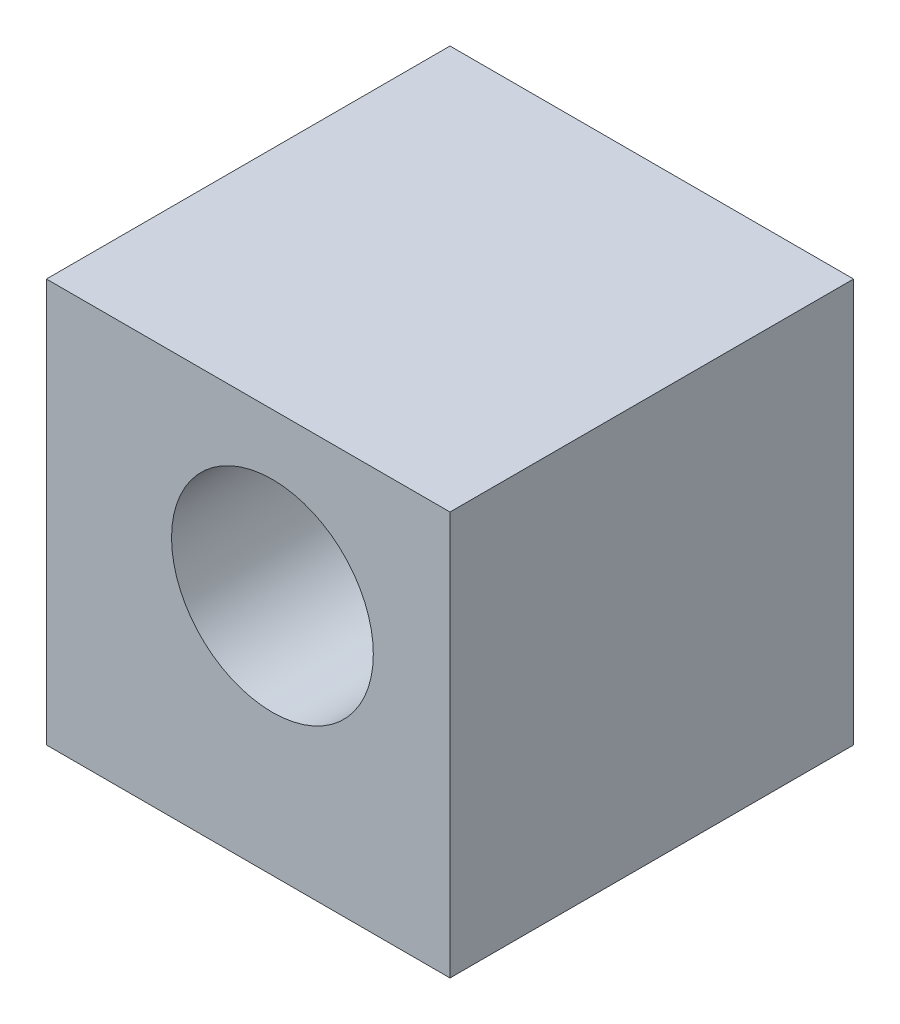
ISO-10303-21;
HEADER;
FILE_DESCRIPTION(('STEP AP214'),'2;1');
FILE_NAME('part.step','',(''),(''),'','','');
FILE_SCHEMA(('AUTOMOTIVE_DESIGN { 1 0 10303 214 1 1 1 1 }'));
ENDSEC;
DATA;
#1=APPLICATION_CONTEXT('core data for automotive mechanical design processes');
#2=APPLICATION_PROTOCOL_DEFINITION('international standard','automotive_design',2000,#1);
#3=PRODUCT_CONTEXT('',#1,'mechanical');
#4=PRODUCT('Part','Part','',(#3));
#5=PRODUCT_RELATED_PRODUCT_CATEGORY('part','',(#4));
#6=PRODUCT_DEFINITION_FORMATION('','',#4);
#7=PRODUCT_DEFINITION_CONTEXT('part definition',#1,'design');
#8=PRODUCT_DEFINITION('design','',#6,#7);
#9=PRODUCT_DEFINITION_SHAPE('','',#8);
#10=(LENGTH_UNIT() NAMED_UNIT(*) SI_UNIT(.MILLI.,.METRE.));
#11=(NAMED_UNIT(*) PLANE_ANGLE_UNIT() SI_UNIT($,.RADIAN.));
#12=(NAMED_UNIT(*) SI_UNIT($,.STERADIAN.) SOLID_ANGLE_UNIT());
#13=UNCERTAINTY_MEASURE_WITH_UNIT(LENGTH_MEASURE(1.E-05),#10,'distance_accuracy_value','');
#14=(GEOMETRIC_REPRESENTATION_CONTEXT(3) GLOBAL_UNCERTAINTY_ASSIGNED_CONTEXT((#13)) GLOBAL_UNIT_ASSIGNED_CONTEXT((#10,
#11,#12)) REPRESENTATION_CONTEXT('',''));
#15=CARTESIAN_POINT('',(0.,0.,0.));
#16=DIRECTION('',(0.,0.,1.));
#17=DIRECTION('',(1.,0.,0.));
#18=AXIS2_PLACEMENT_3D('',#15,#16,#17);
#19=CARTESIAN_POINT('',(-15.,-15.,-30.));
#20=DIRECTION('',(-1.,0.,0.));
#21=DIRECTION('',(0.,0.,1.));
#22=AXIS2_PLACEMENT_3D('',#19,#20,#21);
#23=PLANE('',#22);
#24=CARTESIAN_POINT('',(-15.,-5.,-15.));
#25=DIRECTION('',(-1.,0.,0.));
#26=DIRECTION('',(0.,0.,1.));
#27=AXIS2_PLACEMENT_3D('',#24,#25,#26);
#28=CIRCLE('',#27,4.);
#29=CARTESIAN_POINT('',(-15.,-5.,-11.));
#30=VERTEX_POINT('',#29);
#31=EDGE_CURVE('E106',#30,#30,#28,.T.);
#32=ORIENTED_EDGE('',*,*,#31,.F.);
#33=EDGE_LOOP('',(#32));
#34=FACE_BOUND('',#33,.T.);
#35=DIRECTION('',(0.,-1.,0.));
#36=VECTOR('',#35,1.);
#37=CARTESIAN_POINT('',(-15.,-15.,0.));
#38=LINE('',#37,#36);
#39=CARTESIAN_POINT('',(-15.,15.,0.));
#40=VERTEX_POINT('',#39);
#41=CARTESIAN_POINT('',(-15.,-15.,0.));
#42=VERTEX_POINT('',#41);
#43=EDGE_CURVE('E128',#40,#42,#38,.T.);
#44=ORIENTED_EDGE('',*,*,#43,.F.);
#45=DIRECTION('',(0.,0.,1.));
#46=VECTOR('',#45,1.);
#47=CARTESIAN_POINT('',(-15.,15.,-30.));
#48=LINE('',#47,#46);
#49=CARTESIAN_POINT('',(-15.,15.,-30.));
#50=VERTEX_POINT('',#49);
#51=EDGE_CURVE('E180',#50,#40,#48,.T.);
#52=ORIENTED_EDGE('',*,*,#51,.F.);
#53=DIRECTION('',(0.,-1.,0.));
#54=VECTOR('',#53,1.);
#55=CARTESIAN_POINT('',(-15.,-15.,-30.));
#56=LINE('',#55,#54);
#57=CARTESIAN_POINT('',(-15.,-15.,-30.));
#58=VERTEX_POINT('',#57);
#59=EDGE_CURVE('E134',#50,#58,#56,.T.);
#60=ORIENTED_EDGE('',*,*,#59,.T.);
#61=DIRECTION('',(0.,0.,1.));
#62=VECTOR('',#61,1.);
#63=CARTESIAN_POINT('',(-15.,-15.,-30.));
#64=LINE('',#63,#62);
#65=EDGE_CURVE('E186',#58,#42,#64,.T.);
#66=ORIENTED_EDGE('',*,*,#65,.T.);
#67=EDGE_LOOP('',(#44,#52,#60,#66));
#68=FACE_BOUND('',#67,.T.);
#69=ADVANCED_FACE('F45',(#34,#68),#23,.T.);
#70=CARTESIAN_POINT('',(15.,15.,-30.));
#71=DIRECTION('',(0.,1.,0.));
#72=DIRECTION('',(-1.,0.,0.));
#73=AXIS2_PLACEMENT_3D('',#70,#71,#72);
#74=PLANE('',#73);
#75=DIRECTION('',(-1.,0.,0.));
#76=VECTOR('',#75,1.);
#77=CARTESIAN_POINT('',(15.,15.,0.));
#78=LINE('',#77,#76);
#79=CARTESIAN_POINT('',(15.,15.,0.));
#80=VERTEX_POINT('',#79);
#81=EDGE_CURVE('E177',#80,#40,#78,.T.);
#82=ORIENTED_EDGE('',*,*,#81,.F.);
#83=DIRECTION('',(0.,0.,1.));
#84=VECTOR('',#83,1.);
#85=CARTESIAN_POINT('',(15.,15.,-30.));
#86=LINE('',#85,#84);
#87=CARTESIAN_POINT('',(15.,15.,-30.));
#88=VERTEX_POINT('',#87);
#89=EDGE_CURVE('E182',#88,#80,#86,.T.);
#90=ORIENTED_EDGE('',*,*,#89,.F.);
#91=DIRECTION('',(-1.,0.,0.));
#92=VECTOR('',#91,1.);
#93=CARTESIAN_POINT('',(15.,15.,-30.));
#94=LINE('',#93,#92);
#95=EDGE_CURVE('E170',#88,#50,#94,.T.);
#96=ORIENTED_EDGE('',*,*,#95,.T.);
#97=ORIENTED_EDGE('',*,*,#51,.T.);
#98=EDGE_LOOP('',(#82,#90,#96,#97));
#99=FACE_BOUND('',#98,.T.);
#100=ADVANCED_FACE('F209',(#99),#74,.T.);
#101=CARTESIAN_POINT('',(15.,-15.,-30.));
#102=DIRECTION('',(1.,0.,0.));
#103=DIRECTION('',(0.,0.,-1.));
#104=AXIS2_PLACEMENT_3D('',#101,#102,#103);
#105=PLANE('',#104);
#106=DIRECTION('',(0.,1.,0.));
#107=VECTOR('',#106,1.);
#108=CARTESIAN_POINT('',(15.,-15.,0.));
#109=LINE('',#108,#107);
#110=CARTESIAN_POINT('',(15.,-15.,0.));
#111=VERTEX_POINT('',#110);
#112=EDGE_CURVE('E174',#111,#80,#109,.T.);
#113=ORIENTED_EDGE('',*,*,#112,.F.);
#114=DIRECTION('',(0.,0.,1.));
#115=VECTOR('',#114,1.);
#116=CARTESIAN_POINT('',(15.,-15.,-30.));
#117=LINE('',#116,#115);
#118=CARTESIAN_POINT('',(15.,-15.,-30.));
#119=VERTEX_POINT('',#118);
#120=EDGE_CURVE('E184',#119,#111,#117,.T.);
#121=ORIENTED_EDGE('',*,*,#120,.F.);
#122=DIRECTION('',(0.,1.,0.));
#123=VECTOR('',#122,1.);
#124=CARTESIAN_POINT('',(15.,-15.,-30.));
#125=LINE('',#124,#123);
#126=EDGE_CURVE('E231',#119,#88,#125,.T.);
#127=ORIENTED_EDGE('',*,*,#126,.T.);
#128=ORIENTED_EDGE('',*,*,#89,.T.);
#129=EDGE_LOOP('',(#113,#121,#127,#128));
#130=FACE_BOUND('',#129,.T.);
#131=ADVANCED_FACE('F214',(#130),#105,.T.);
#132=CARTESIAN_POINT('',(15.,-15.,-30.));
#133=DIRECTION('',(0.,-1.,0.));
#134=DIRECTION('',(0.,0.,-1.));
#135=AXIS2_PLACEMENT_3D('',#132,#133,#134);
#136=PLANE('',#135);
#137=CARTESIAN_POINT('',(5.,-15.,-15.));
#138=DIRECTION('',(0.,-1.,0.));
#139=DIRECTION('',(0.,0.,-1.));
#140=AXIS2_PLACEMENT_3D('',#137,#138,#139);
#141=CIRCLE('',#140,4.);
#142=CARTESIAN_POINT('',(5.,-15.,-19.));
#143=VERTEX_POINT('',#142);
#144=EDGE_CURVE('E107',#143,#143,#141,.T.);
#145=ORIENTED_EDGE('',*,*,#144,.F.);
#146=EDGE_LOOP('',(#145));
#147=FACE_BOUND('',#146,.T.);
#148=DIRECTION('',(1.,0.,0.));
#149=VECTOR('',#148,1.);
#150=CARTESIAN_POINT('',(15.,-15.,0.));
#151=LINE('',#150,#149);
#152=EDGE_CURVE('E169',#42,#111,#151,.T.);
#153=ORIENTED_EDGE('',*,*,#152,.F.);
#154=ORIENTED_EDGE('',*,*,#65,.F.);
#155=DIRECTION('',(1.,0.,0.));
#156=VECTOR('',#155,1.);
#157=CARTESIAN_POINT('',(15.,-15.,-30.));
#158=LINE('',#157,#156);
#159=EDGE_CURVE('E232',#58,#119,#158,.T.);
#160=ORIENTED_EDGE('',*,*,#159,.T.);
#161=ORIENTED_EDGE('',*,*,#120,.T.);
#162=EDGE_LOOP('',(#153,#154,#160,#161));
#163=FACE_BOUND('',#162,.T.);
#164=ADVANCED_FACE('F239',(#147,#163),#136,.T.);
#165=CARTESIAN_POINT('',(0.,0.,-30.));
#166=DIRECTION('',(0.,0.,1.));
#167=DIRECTION('',(1.,0.,0.));
#168=AXIS2_PLACEMENT_3D('',#165,#166,#167);
#169=PLANE('',#168);
#170=CARTESIAN_POINT('',(1.8,3.,-30.));
#171=DIRECTION('',(0.,0.,1.));
#172=DIRECTION('',(1.,0.,0.));
#173=AXIS2_PLACEMENT_3D('',#170,#171,#172);
#174=CIRCLE('',#173,7.5);
#175=CARTESIAN_POINT('',(9.3,3.,-30.));
#176=VERTEX_POINT('',#175);
#177=EDGE_CURVE('E121',#176,#176,#174,.T.);
#178=ORIENTED_EDGE('',*,*,#177,.T.);
#179=EDGE_LOOP('',(#178));
#180=FACE_BOUND('',#179,.T.);
#181=ORIENTED_EDGE('',*,*,#59,.F.);
#182=ORIENTED_EDGE('',*,*,#95,.F.);
#183=ORIENTED_EDGE('',*,*,#126,.F.);
#184=ORIENTED_EDGE('',*,*,#159,.F.);
#185=EDGE_LOOP('',(#181,#182,#183,#184));
#186=FACE_BOUND('',#185,.T.);
#187=ADVANCED_FACE('F237',(#180,#186),#169,.F.);
#188=CARTESIAN_POINT('',(0.,0.,0.));
#189=DIRECTION('',(0.,0.,1.));
#190=DIRECTION('',(1.,0.,0.));
#191=AXIS2_PLACEMENT_3D('',#188,#189,#190);
#192=PLANE('',#191);
#193=CARTESIAN_POINT('',(1.8,3.,0.));
#194=DIRECTION('',(0.,0.,1.));
#195=DIRECTION('',(1.,0.,0.));
#196=AXIS2_PLACEMENT_3D('',#193,#194,#195);
#197=CIRCLE('',#196,7.5);
#198=CARTESIAN_POINT('',(9.3,3.,0.));
#199=VERTEX_POINT('',#198);
#200=EDGE_CURVE('E124',#199,#199,#197,.T.);
#201=ORIENTED_EDGE('',*,*,#200,.F.);
#202=EDGE_LOOP('',(#201));
#203=FACE_BOUND('',#202,.T.);
#204=ORIENTED_EDGE('',*,*,#43,.T.);
#205=ORIENTED_EDGE('',*,*,#152,.T.);
#206=ORIENTED_EDGE('',*,*,#112,.T.);
#207=ORIENTED_EDGE('',*,*,#81,.T.);
#208=EDGE_LOOP('',(#204,#205,#206,#207));
#209=FACE_BOUND('',#208,.T.);
#210=ADVANCED_FACE('F113',(#203,#209),#192,.T.);
#211=CARTESIAN_POINT('',(1.8,3.,-30.));
#212=DIRECTION('',(0.,0.,1.));
#213=DIRECTION('',(1.,0.,0.));
#214=AXIS2_PLACEMENT_3D('',#211,#212,#213);
#215=CYLINDRICAL_SURFACE('',#214,7.5);
#216=DIRECTION('',(0.,0.,1.));
#217=VECTOR('',#216,1.);
#218=CARTESIAN_POINT('',(6.3,-3.,-30.));
#219=LINE('',#218,#217);
#220=CARTESIAN_POINT('',(6.3,-3.,-11.2171439361245));
#221=VERTEX_POINT('',#220);
#222=CARTESIAN_POINT('',(6.3,-3.,-18.7828560638755));
#223=VERTEX_POINT('',#222);
#224=EDGE_CURVE('E57',#221,#223,#219,.F.);
#225=ORIENTED_EDGE('',*,*,#224,.F.);
#226=CARTESIAN_POINT('',(6.3,-3.,-11.2171439361245));
#227=CARTESIAN_POINT('',(6.20453331171211,-3.07161593823113,-11.1843345075212));
#228=CARTESIAN_POINT('',(6.10659975786473,-3.14148981185558,-11.1547226743264));
#229=CARTESIAN_POINT('',(5.90607954053129,-3.27731958893225,-11.1025954859788));
#230=CARTESIAN_POINT('',(5.80348802057571,-3.34327122952458,-11.0800877414716));
#231=CARTESIAN_POINT('',(5.59339470033022,-3.47111992684683,-11.042811320577));
#232=CARTESIAN_POINT('',(5.48586320505372,-3.53298486615584,-11.0280987346706));
#233=CARTESIAN_POINT('',(5.26722604444605,-3.6516013690662,-11.0074266067944));
#234=CARTESIAN_POINT('',(5.15612152823245,-3.7083545547738,-11.0014642788658));
#235=CARTESIAN_POINT('',(4.9303098042313,-3.81666704654821,-10.9990025956759));
#236=CARTESIAN_POINT('',(4.81558255265852,-3.86818642080788,-11.0025710372425));
#237=CARTESIAN_POINT('',(4.58434825171591,-3.96513576389669,-11.0199658971347));
#238=CARTESIAN_POINT('',(4.46784146116583,-4.01056660903416,-11.0337908373895));
#239=CARTESIAN_POINT('',(4.23470391545364,-4.09489442151968,-11.072122027588));
#240=CARTESIAN_POINT('',(4.1180751737444,-4.13381468834416,-11.0965890090778));
#241=CARTESIAN_POINT('',(3.88566382479191,-4.20519095484145,-11.1564798554882));
#242=CARTESIAN_POINT('',(3.76988106544124,-4.23764814557108,-11.1919016984995));
#243=CARTESIAN_POINT('',(3.55666846320318,-4.29208340291974,-11.2680087540223));
#244=CARTESIAN_POINT('',(3.45893709643152,-4.31489224134514,-11.307264400876));
#245=CARTESIAN_POINT('',(3.26606777469389,-4.35597496395508,-11.3938036974439));
#246=CARTESIAN_POINT('',(3.17093063550716,-4.37424743594754,-11.4410898393932));
#247=CARTESIAN_POINT('',(2.98414371431365,-4.40653722087117,-11.5434595872196));
#248=CARTESIAN_POINT('',(2.8924954788859,-4.42055266550239,-11.5985466011937));
#249=CARTESIAN_POINT('',(2.71352827679908,-4.44470443605574,-11.7161730930033));
#250=CARTESIAN_POINT('',(2.62621097617683,-4.45483927909745,-11.7787154077591));
#251=CARTESIAN_POINT('',(2.46048009404579,-4.47130436184433,-11.9078529847188));
#252=CARTESIAN_POINT('',(2.38184303635272,-4.47778427953755,-11.9741425721223));
#253=CARTESIAN_POINT('',(2.22980365912327,-4.48806253806928,-12.1126815741655));
#254=CARTESIAN_POINT('',(2.15640315520608,-4.49185995285297,-12.1849330373626));
#255=CARTESIAN_POINT('',(1.94492250356126,-4.49992529149385,-12.4098726881836));
#256=CARTESIAN_POINT('',(1.81538791152055,-4.50088152968076,-12.5708828305501));
#257=CARTESIAN_POINT('',(1.57675005604662,-4.49767962716289,-12.9195410179257));
#258=CARTESIAN_POINT('',(1.46903705823203,-4.49325641010039,-13.1081322314241));
#259=CARTESIAN_POINT('',(1.28548532791577,-4.48289688940755,-13.5002524979118));
#260=CARTESIAN_POINT('',(1.20965428147818,-4.4769602214697,-13.7037851390878));
#261=CARTESIAN_POINT('',(1.08970564606854,-4.46654485555887,-14.1282190548949));
#262=CARTESIAN_POINT('',(1.04686596409362,-4.46212826517117,-14.3494843757512));
#263=CARTESIAN_POINT('',(0.998891746198999,-4.45713213552695,-14.7960979299247));
#264=CARTESIAN_POINT('',(0.993755633693872,-4.45655243582986,-15.0214459921259));
#265=CARTESIAN_POINT('',(1.0213052322195,-4.45947813544291,-15.4692141873663));
#266=CARTESIAN_POINT('',(1.05389403135866,-4.46297306755622,-15.6916403447726));
#267=CARTESIAN_POINT('',(1.1557639014937,-4.47245290325796,-16.1278569728002));
#268=CARTESIAN_POINT('',(1.22504995745192,-4.47843814510684,-16.3416462659408));
#269=CARTESIAN_POINT('',(1.39869969937344,-4.48975930969005,-16.7552765289063));
#270=CARTESIAN_POINT('',(1.50315202035799,-4.49509354483604,-16.9550806972674));
#271=CARTESIAN_POINT('',(1.68372596656373,-4.49933879301548,-17.2394200230693));
#272=CARTESIAN_POINT('',(1.74794214230325,-4.50012725131469,-17.3316855742863));
#273=CARTESIAN_POINT('',(1.88389759117182,-4.49983895631812,-17.5104766326975));
#274=CARTESIAN_POINT('',(1.95563373425873,-4.49876297618573,-17.5970045038001));
#275=CARTESIAN_POINT('',(2.10565679940091,-4.49414238837778,-17.7631942077441));
#276=CARTESIAN_POINT('',(2.18390328602827,-4.49061214424855,-17.8428929748076));
#277=CARTESIAN_POINT('',(2.34664882804639,-4.48049578961297,-17.9953550353473));
#278=CARTESIAN_POINT('',(2.43114523681459,-4.47391096645668,-18.0681212349914));
#279=CARTESIAN_POINT('',(2.6056811061393,-4.45711478735502,-18.2061840851399));
#280=CARTESIAN_POINT('',(2.69571973297103,-4.44690397577612,-18.2714818549287));
#281=CARTESIAN_POINT('',(2.88052192610311,-4.42234176521211,-18.3941285553296));
#282=CARTESIAN_POINT('',(2.97528522957024,-4.40799059634248,-18.4514779274408));
#283=CARTESIAN_POINT('',(3.16358354886144,-4.37558716113939,-18.5550688982341));
#284=CARTESIAN_POINT('',(3.2569261745594,-4.35776617014349,-18.601733041018));
#285=CARTESIAN_POINT('',(3.44621491290839,-4.3177411598104,-18.6873492957098));
#286=CARTESIAN_POINT('',(3.54216189186171,-4.29553566622859,-18.7262988048022));
#287=CARTESIAN_POINT('',(3.73565069410068,-4.24659947939606,-18.7963134869348));
#288=CARTESIAN_POINT('',(3.83319089357468,-4.21987316193409,-18.8273862120743));
#289=CARTESIAN_POINT('',(4.02911012294153,-4.16180928649055,-18.8817151012253));
#290=CARTESIAN_POINT('',(4.12748945131836,-4.13047001720308,-18.90496835382));
#291=CARTESIAN_POINT('',(4.32138811134016,-4.06419079386261,-18.9432179035529));
#292=CARTESIAN_POINT('',(4.41690869947549,-4.02937958815782,-18.9584315020861));
#293=CARTESIAN_POINT('',(4.60720580531732,-3.95557596616305,-18.9818233747847));
#294=CARTESIAN_POINT('',(4.70198204793624,-3.9165820755393,-18.9899991590009));
#295=CARTESIAN_POINT('',(4.98441562280454,-3.79349407995743,-19.0044049017068));
#296=CARTESIAN_POINT('',(5.17005293536341,-3.70333614212161,-19.0004896324649));
#297=CARTESIAN_POINT('',(5.51909599823201,-3.51574661312313,-18.9697812561019));
#298=CARTESIAN_POINT('',(5.68315343971844,-3.41923700942251,-18.9445744856711));
#299=CARTESIAN_POINT('',(5.92098107775977,-3.26708413820115,-18.8933711081726));
#300=CARTESIAN_POINT('',(5.99873724526244,-3.21524308305709,-18.8741214858392));
#301=CARTESIAN_POINT('',(6.15147136717547,-3.10928257451317,-18.8315000289769));
#302=CARTESIAN_POINT('',(6.22645048466103,-3.05516409569609,-18.8081299443404));
#303=CARTESIAN_POINT('',(6.3,-3.,-18.7828560638755));
#304=B_SPLINE_CURVE_WITH_KNOTS('',3,(#226,#227,#228,#229,#230,#231,#232,#233,#234,#235,#236,
#237,#238,#239,#240,#241,#242,#243,#244,#245,#246,#247,#248,#249,#250,#251,#252,#253,#254,#255,
#256,#257,#258,#259,#260,#261,#262,#263,#264,#265,#266,#267,#268,#269,#270,#271,#272,#273,#274,
#275,#276,#277,#278,#279,#280,#281,#282,#283,#284,#285,#286,#287,#288,#289,#290,#291,#292,#293,
#294,#295,#296,#297,#298,#299,#300,#301,#302,#303),.UNSPECIFIED.,.F.,.F.,(4,2,2,2,2,2,2,2,2,2,2,
2,2,2,2,2,2,2,2,2,2,2,2,2,2,2,2,2,2,2,2,2,2,2,2,2,2,2,4),(0.,0.37130479133255,0.74300602370304,
1.11734672604486,1.49156821770892,1.86845879934309,2.24529507757166,2.62075249614878,
2.99614065887571,3.31901341290955,3.64198655305974,3.96510123369428,4.28833926205707,
4.59714387633755,4.90605504425132,5.52321668459412,6.17206147329793,6.8210625951863,
7.49408886648134,8.16708699483217,8.83836008124406,9.50972437691513,10.1827936449383,
10.519702430626,10.8564715371487,11.1912861190986,11.5259597217153,11.8605831013034,
12.1951878865564,12.5123924042022,12.8297037608427,13.1467097252551,13.46383358985,
13.7718798047857,14.0800349604454,14.6967428010874,15.2711842045362,15.557293890626,
15.8432823620387),.UNSPECIFIED.);
#305=EDGE_CURVE('E12',#221,#223,#304,.T.);
#306=ORIENTED_EDGE('',*,*,#305,.T.);
#307=EDGE_LOOP('',(#225,#306));
#308=FACE_BOUND('',#307,.T.);
#309=DIRECTION('',(0.,0.,1.));
#310=VECTOR('',#309,1.);
#311=CARTESIAN_POINT('',(-2.,-3.46606526413089,-30.));
#312=LINE('',#311,#310);
#313=CARTESIAN_POINT('',(-2.,-3.46606526413089,-11.3058093949968));
#314=VERTEX_POINT('',#313);
#315=CARTESIAN_POINT('',(-2.,-3.46606526413089,-18.6941906050032));
#316=VERTEX_POINT('',#315);
#317=EDGE_CURVE('E117',#314,#316,#312,.F.);
#318=ORIENTED_EDGE('',*,*,#317,.F.);
#319=CARTESIAN_POINT('',(-2.,-3.46606526413089,-11.3058093949968));
#320=CARTESIAN_POINT('',(-2.1115351586227,-3.40055196488591,-11.3330276232183));
#321=CARTESIAN_POINT('',(-2.22083206188056,-3.33240549234354,-11.3633539459014));
#322=CARTESIAN_POINT('',(-2.43439740367824,-3.19161886690264,-11.4312596342529));
#323=CARTESIAN_POINT('',(-2.53865789057621,-3.11897199640926,-11.4688500290739));
#324=CARTESIAN_POINT('',(-2.74184255986799,-2.96972986090865,-11.5524862773575));
#325=CARTESIAN_POINT('',(-2.84073213079694,-2.89311406625536,-11.5985800959999));
#326=CARTESIAN_POINT('',(-3.03167989816068,-2.73759573075159,-11.699979524936));
#327=CARTESIAN_POINT('',(-3.12374256247765,-2.65869473332972,-11.7552790322534));
#328=CARTESIAN_POINT('',(-3.28325984852843,-2.51540128009014,-11.8642020761516));
#329=CARTESIAN_POINT('',(-3.35203253902814,-2.45115063585463,-11.9160855534827));
#330=CARTESIAN_POINT('',(-3.48429261759763,-2.32303690792524,-12.0266143733814));
#331=CARTESIAN_POINT('',(-3.54778108607087,-2.25917374749486,-12.0852583278356));
#332=CARTESIAN_POINT('',(-3.66899718267748,-2.1330015746171,-12.2092791627887));
#333=CARTESIAN_POINT('',(-3.72673970502079,-2.07068887561929,-12.2746376933078));
#334=CARTESIAN_POINT('',(-3.83637865946202,-1.94853207129684,-12.4121446447983));
#335=CARTESIAN_POINT('',(-3.88827784925533,-1.88868681001624,-12.4842898331243));
#336=CARTESIAN_POINT('',(-3.98641117361342,-1.77213676267049,-12.6356648205301));
#337=CARTESIAN_POINT('',(-4.03260649750584,-1.71545479152422,-12.7149374226294));
#338=CARTESIAN_POINT('',(-4.11886193892024,-1.60672250722643,-12.8797607749099));
#339=CARTESIAN_POINT('',(-4.15892187321887,-1.55467233241534,-12.9653117124703));
#340=CARTESIAN_POINT('',(-4.23294601099935,-1.45616029587068,-13.1421904445961));
#341=CARTESIAN_POINT('',(-4.26690511373653,-1.40970312090206,-13.2335229875351));
#342=CARTESIAN_POINT('',(-4.32876609584355,-1.3233148997842,-13.4211858573168));
#343=CARTESIAN_POINT('',(-4.35666846491612,-1.28338332608762,-13.5175157793274));
#344=CARTESIAN_POINT('',(-4.40424043409975,-1.21414265095231,-13.705259599574));
#345=CARTESIAN_POINT('',(-4.42443232393688,-1.18419316424096,-13.7963061100391));
#346=CARTESIAN_POINT('',(-4.46004798238159,-1.13071822941098,-13.9812148433114));
#347=CARTESIAN_POINT('',(-4.47547009491106,-1.10719501283883,-14.0750780316948));
#348=CARTESIAN_POINT('',(-4.50162832919832,-1.06694685242755,-14.2648182186281));
#349=CARTESIAN_POINT('',(-4.51236784954208,-1.05021697864538,-14.3606937035184));
#350=CARTESIAN_POINT('',(-4.52926268537931,-1.02376453117324,-14.553842849692));
#351=CARTESIAN_POINT('',(-4.53541631294567,-1.0140445376486,-14.6511170123714));
#352=CARTESIAN_POINT('',(-4.54308114880651,-1.00192091764165,-14.8437107024956));
#353=CARTESIAN_POINT('',(-4.54471091097941,-0.999330467838626,-14.9390138272556));
#354=CARTESIAN_POINT('',(-4.54368124847485,-1.00096355232976,-15.1295736144671));
#355=CARTESIAN_POINT('',(-4.54102027797746,-1.00518954237918,-15.2248302478006));
#356=CARTESIAN_POINT('',(-4.5313865806278,-1.02040105678881,-15.4145403096169));
#357=CARTESIAN_POINT('',(-4.52441574502791,-1.0313836162249,-15.5089940719947));
#358=CARTESIAN_POINT('',(-4.50610638992259,-1.05996426897913,-15.6965023934458));
#359=CARTESIAN_POINT('',(-4.49476626739522,-1.07756479026514,-15.789556425946));
#360=CARTESIAN_POINT('',(-4.4676645351062,-1.11910113790052,-15.9733892332673));
#361=CARTESIAN_POINT('',(-4.45191154899517,-1.14302460280498,-16.0641720732787));
#362=CARTESIAN_POINT('',(-4.41587300394048,-1.19690035743993,-16.243044948683));
#363=CARTESIAN_POINT('',(-4.39558580044383,-1.22685483421639,-16.3311339938294));
#364=CARTESIAN_POINT('',(-4.35039275770745,-1.29234779532893,-16.503944612487));
#365=CARTESIAN_POINT('',(-4.32548880309215,-1.32788400022233,-16.5886675430191));
#366=CARTESIAN_POINT('',(-4.27096244115155,-1.40404459823363,-16.7542560433457));
#367=CARTESIAN_POINT('',(-4.24133830755613,-1.44467085172487,-16.8351201877851));
#368=CARTESIAN_POINT('',(-4.17711397643731,-1.53067341713871,-16.9929618543268));
#369=CARTESIAN_POINT('',(-4.1424837127451,-1.57607794321057,-17.0699117954551));
#370=CARTESIAN_POINT('',(-4.0683755158004,-1.67073795703248,-17.2189697051975));
#371=CARTESIAN_POINT('',(-4.02889583439121,-1.71999483116931,-17.291075913129));
#372=CARTESIAN_POINT('',(-3.90326976141475,-1.87236675985036,-17.4994837424739));
#373=CARTESIAN_POINT('',(-3.80984680040281,-1.98020698242489,-17.6280966387525));
#374=CARTESIAN_POINT('',(-3.59988530812838,-2.20732698036231,-17.8687483427684));
#375=CARTESIAN_POINT('',(-3.48246486468787,-2.32690636226503,-17.9797203542959));
#376=CARTESIAN_POINT('',(-3.22931258571404,-2.56654330874483,-18.1784566415336));
#377=CARTESIAN_POINT('',(-3.09354399435542,-2.68660135122865,-18.2661732585883));
#378=CARTESIAN_POINT('',(-2.87772459535221,-2.86325146287614,-18.382210154239));
#379=CARTESIAN_POINT('',(-2.80336824331119,-2.92183629373541,-18.4184360452378));
#380=CARTESIAN_POINT('',(-2.65103105401578,-3.03717091249552,-18.4859377308999));
#381=CARTESIAN_POINT('',(-2.57304962151715,-3.0939203964167,-18.5172127088744));
#382=CARTESIAN_POINT('',(-2.414201310312,-3.20482432227153,-18.5750865919377));
#383=CARTESIAN_POINT('',(-2.33334985194806,-3.25898978472566,-18.6017069483917));
#384=CARTESIAN_POINT('',(-2.16876706921544,-3.36462702515971,-18.6508813194922));
#385=CARTESIAN_POINT('',(-2.08503734290335,-3.4161002591165,-18.673437548529));
#386=CARTESIAN_POINT('',(-2.,-3.46606526413089,-18.6941906050032));
#387=B_SPLINE_CURVE_WITH_KNOTS('',3,(#319,#320,#321,#322,#323,#324,#325,#326,#327,#328,#329,
#330,#331,#332,#333,#334,#335,#336,#337,#338,#339,#340,#341,#342,#343,#344,#345,#346,#347,#348,
#349,#350,#351,#352,#353,#354,#355,#356,#357,#358,#359,#360,#361,#362,#363,#364,#365,#366,#367,
#368,#369,#370,#371,#372,#373,#374,#375,#376,#377,#378,#379,#380,#381,#382,#383,#384,#385,#386),
.UNSPECIFIED.,.F.,.F.,(4,2,2,2,2,2,2,2,2,2,2,2,2,2,2,2,2,2,2,2,2,2,2,2,2,2,2,2,2,2,2,2,2,4),(0.,
0.396561020055445,0.79372894393754,1.19320975665965,1.59242677782926,1.91452046109837,
2.23654812700906,2.5577180357904,2.87873573099937,3.20182966182852,3.52493323944712,
3.84830571087222,4.17165202704183,4.465141563838,4.75873288680635,5.05211076751641,
5.34559657840627,5.63131513570289,5.91713665167022,6.20283283254687,6.48863393077563,
6.7738803645823,7.05923042516712,7.3444642572196,7.62980264582065,7.91693201845828,
8.20416520323194,8.77783241760802,9.37853616210649,9.98046161138735,10.2843723272929,
10.5883331233385,10.8908538771671,11.1932092970305),.UNSPECIFIED.);
#388=EDGE_CURVE('E103',#314,#316,#387,.T.);
#389=ORIENTED_EDGE('',*,*,#388,.T.);
#390=EDGE_LOOP('',(#318,#389));
#391=FACE_BOUND('',#390,.T.);
#392=ORIENTED_EDGE('',*,*,#177,.F.);
#393=EDGE_LOOP('',(#392));
#394=FACE_BOUND('',#393,.T.);
#395=ORIENTED_EDGE('',*,*,#200,.T.);
#396=EDGE_LOOP('',(#395));
#397=FACE_BOUND('',#396,.T.);
#398=ADVANCED_FACE('F109',(#308,#391,#394,#397),#215,.F.);
#399=CARTESIAN_POINT('',(-2.,-5.,-15.));
#400=DIRECTION('',(-1.,0.,0.));
#401=DIRECTION('',(0.,0.,1.));
#402=AXIS2_PLACEMENT_3D('',#399,#400,#401);
#403=CYLINDRICAL_SURFACE('',#402,4.);
#404=ORIENTED_EDGE('',*,*,#31,.T.);
#405=EDGE_LOOP('',(#404));
#406=FACE_BOUND('',#405,.T.);
#407=CARTESIAN_POINT('',(-2.,-5.,-15.));
#408=DIRECTION('',(-1.,0.,0.));
#409=DIRECTION('',(0.,0.,1.));
#410=AXIS2_PLACEMENT_3D('',#407,#408,#409);
#411=CIRCLE('',#410,4.);
#412=EDGE_CURVE('E70',#316,#314,#411,.T.);
#413=ORIENTED_EDGE('',*,*,#412,.F.);
#414=ORIENTED_EDGE('',*,*,#388,.F.);
#415=EDGE_LOOP('',(#413,#414));
#416=FACE_BOUND('',#415,.T.);
#417=ADVANCED_FACE('F112',(#406,#416),#403,.F.);
#418=CARTESIAN_POINT('',(-2.,-5.,-15.));
#419=DIRECTION('',(-1.,0.,0.));
#420=DIRECTION('',(0.,0.,1.));
#421=AXIS2_PLACEMENT_3D('',#418,#419,#420);
#422=PLANE('',#421);
#423=ORIENTED_EDGE('',*,*,#317,.T.);
#424=ORIENTED_EDGE('',*,*,#412,.T.);
#425=EDGE_LOOP('',(#423,#424));
#426=FACE_BOUND('',#425,.T.);
#427=ADVANCED_FACE('F198',(#426),#422,.T.);
#428=CARTESIAN_POINT('',(5.,-3.,-15.));
#429=DIRECTION('',(0.,-1.,0.));
#430=DIRECTION('',(0.,0.,-1.));
#431=AXIS2_PLACEMENT_3D('',#428,#429,#430);
#432=CYLINDRICAL_SURFACE('',#431,4.);
#433=ORIENTED_EDGE('',*,*,#144,.T.);
#434=EDGE_LOOP('',(#433));
#435=FACE_BOUND('',#434,.T.);
#436=CARTESIAN_POINT('',(5.,-3.,-15.));
#437=DIRECTION('',(0.,-1.,0.));
#438=DIRECTION('',(0.,0.,-1.));
#439=AXIS2_PLACEMENT_3D('',#436,#437,#438);
#440=CIRCLE('',#439,4.);
#441=EDGE_CURVE('E63',#223,#221,#440,.T.);
#442=ORIENTED_EDGE('',*,*,#441,.F.);
#443=ORIENTED_EDGE('',*,*,#305,.F.);
#444=EDGE_LOOP('',(#442,#443));
#445=FACE_BOUND('',#444,.T.);
#446=ADVANCED_FACE('F105',(#435,#445),#432,.F.);
#447=CARTESIAN_POINT('',(5.,-3.,-15.));
#448=DIRECTION('',(0.,-1.,0.));
#449=DIRECTION('',(0.,0.,-1.));
#450=AXIS2_PLACEMENT_3D('',#447,#448,#449);
#451=PLANE('',#450);
#452=ORIENTED_EDGE('',*,*,#224,.T.);
#453=ORIENTED_EDGE('',*,*,#441,.T.);
#454=EDGE_LOOP('',(#452,#453));
#455=FACE_BOUND('',#454,.T.);
#456=ADVANCED_FACE('F101',(#455),#451,.T.);
#457=CLOSED_SHELL('',(#69,#100,#131,#164,#187,#210,#398,#417,#427,#446,#456));
#458=MANIFOLD_SOLID_BREP('B2',#457);
#459=ADVANCED_BREP_SHAPE_REPRESENTATION('',(#18,#458),#14);
#460=SHAPE_DEFINITION_REPRESENTATION(#9,#459);
ENDSEC;
END-ISO-10303-21;
